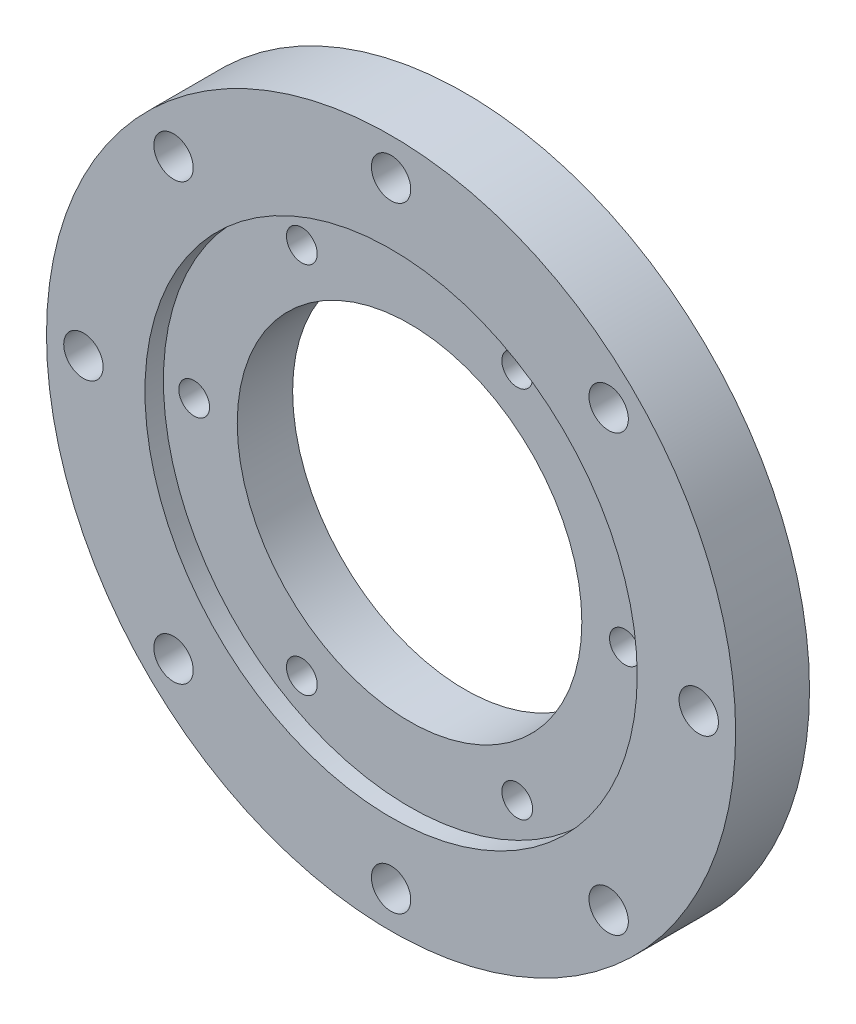
ISO-10303-21;
HEADER;
FILE_DESCRIPTION(('STEP AP214'),'2;1');
FILE_NAME('part.step','',(''),(''),'','','');
FILE_SCHEMA(('AUTOMOTIVE_DESIGN { 1 0 10303 214 1 1 1 1 }'));
ENDSEC;
DATA;
#1=APPLICATION_CONTEXT('core data for automotive mechanical design processes');
#2=APPLICATION_PROTOCOL_DEFINITION('international standard','automotive_design',2000,#1);
#3=PRODUCT_CONTEXT('',#1,'mechanical');
#4=PRODUCT('Part','Part','',(#3));
#5=PRODUCT_RELATED_PRODUCT_CATEGORY('part','',(#4));
#6=PRODUCT_DEFINITION_FORMATION('','',#4);
#7=PRODUCT_DEFINITION_CONTEXT('part definition',#1,'design');
#8=PRODUCT_DEFINITION('design','',#6,#7);
#9=PRODUCT_DEFINITION_SHAPE('','',#8);
#10=(LENGTH_UNIT() NAMED_UNIT(*) SI_UNIT(.MILLI.,.METRE.));
#11=(NAMED_UNIT(*) PLANE_ANGLE_UNIT() SI_UNIT($,.RADIAN.));
#12=(NAMED_UNIT(*) SI_UNIT($,.STERADIAN.) SOLID_ANGLE_UNIT());
#13=UNCERTAINTY_MEASURE_WITH_UNIT(LENGTH_MEASURE(1.E-05),#10,'distance_accuracy_value','');
#14=(GEOMETRIC_REPRESENTATION_CONTEXT(3) GLOBAL_UNCERTAINTY_ASSIGNED_CONTEXT((#13)) GLOBAL_UNIT_ASSIGNED_CONTEXT((#10,
#11,#12)) REPRESENTATION_CONTEXT('',''));
#15=CARTESIAN_POINT('',(0.,0.,0.));
#16=DIRECTION('',(0.,0.,1.));
#17=DIRECTION('',(1.,0.,0.));
#18=AXIS2_PLACEMENT_3D('',#15,#16,#17);
#19=CARTESIAN_POINT('',(0.,0.,0.));
#20=DIRECTION('',(0.,0.,1.));
#21=DIRECTION('',(1.,0.,0.));
#22=AXIS2_PLACEMENT_3D('',#19,#20,#21);
#23=PLANE('',#22);
#24=CARTESIAN_POINT('',(0.,25.,0.));
#25=DIRECTION('',(0.,0.,-1.));
#26=DIRECTION('',(-1.,0.,0.));
#27=AXIS2_PLACEMENT_3D('',#24,#25,#26);
#28=CIRCLE('',#27,1.6);
#29=CARTESIAN_POINT('',(-1.6,25.,0.));
#30=VERTEX_POINT('',#29);
#31=EDGE_CURVE('E147',#30,#30,#28,.T.);
#32=ORIENTED_EDGE('',*,*,#31,.F.);
#33=EDGE_LOOP('',(#32));
#34=FACE_BOUND('',#33,.T.);
#35=CARTESIAN_POINT('',(17.6776695296637,17.6776695296637,0.));
#36=DIRECTION('',(0.,0.,-1.));
#37=DIRECTION('',(-1.,0.,0.));
#38=AXIS2_PLACEMENT_3D('',#35,#36,#37);
#39=CIRCLE('',#38,1.6);
#40=CARTESIAN_POINT('',(16.0776695296637,17.6776695296637,0.));
#41=VERTEX_POINT('',#40);
#42=EDGE_CURVE('E141',#41,#41,#39,.T.);
#43=ORIENTED_EDGE('',*,*,#42,.F.);
#44=EDGE_LOOP('',(#43));
#45=FACE_BOUND('',#44,.T.);
#46=CARTESIAN_POINT('',(25.,0.,0.));
#47=DIRECTION('',(0.,0.,-1.));
#48=DIRECTION('',(-1.,0.,0.));
#49=AXIS2_PLACEMENT_3D('',#46,#47,#48);
#50=CIRCLE('',#49,1.6);
#51=CARTESIAN_POINT('',(23.4,0.,0.));
#52=VERTEX_POINT('',#51);
#53=EDGE_CURVE('E135',#52,#52,#50,.T.);
#54=ORIENTED_EDGE('',*,*,#53,.F.);
#55=EDGE_LOOP('',(#54));
#56=FACE_BOUND('',#55,.T.);
#57=CARTESIAN_POINT('',(17.6776695296637,-17.6776695296637,0.));
#58=DIRECTION('',(0.,0.,-1.));
#59=DIRECTION('',(-1.,0.,0.));
#60=AXIS2_PLACEMENT_3D('',#57,#58,#59);
#61=CIRCLE('',#60,1.6);
#62=CARTESIAN_POINT('',(16.0776695296637,-17.6776695296637,0.));
#63=VERTEX_POINT('',#62);
#64=EDGE_CURVE('E129',#63,#63,#61,.T.);
#65=ORIENTED_EDGE('',*,*,#64,.F.);
#66=EDGE_LOOP('',(#65));
#67=FACE_BOUND('',#66,.T.);
#68=CARTESIAN_POINT('',(0.,-25.,0.));
#69=DIRECTION('',(0.,0.,-1.));
#70=DIRECTION('',(-1.,0.,0.));
#71=AXIS2_PLACEMENT_3D('',#68,#69,#70);
#72=CIRCLE('',#71,1.6);
#73=CARTESIAN_POINT('',(-1.6,-25.,0.));
#74=VERTEX_POINT('',#73);
#75=EDGE_CURVE('E123',#74,#74,#72,.T.);
#76=ORIENTED_EDGE('',*,*,#75,.F.);
#77=EDGE_LOOP('',(#76));
#78=FACE_BOUND('',#77,.T.);
#79=CARTESIAN_POINT('',(-17.6776695296637,-17.6776695296637,0.));
#80=DIRECTION('',(0.,0.,-1.));
#81=DIRECTION('',(-1.,0.,0.));
#82=AXIS2_PLACEMENT_3D('',#79,#80,#81);
#83=CIRCLE('',#82,1.6);
#84=CARTESIAN_POINT('',(-19.2776695296637,-17.6776695296637,0.));
#85=VERTEX_POINT('',#84);
#86=EDGE_CURVE('E117',#85,#85,#83,.T.);
#87=ORIENTED_EDGE('',*,*,#86,.F.);
#88=EDGE_LOOP('',(#87));
#89=FACE_BOUND('',#88,.T.);
#90=CARTESIAN_POINT('',(-25.,0.,0.));
#91=DIRECTION('',(0.,0.,-1.));
#92=DIRECTION('',(-1.,0.,0.));
#93=AXIS2_PLACEMENT_3D('',#90,#91,#92);
#94=CIRCLE('',#93,1.6);
#95=CARTESIAN_POINT('',(-26.6,0.,0.));
#96=VERTEX_POINT('',#95);
#97=EDGE_CURVE('E111',#96,#96,#94,.T.);
#98=ORIENTED_EDGE('',*,*,#97,.F.);
#99=EDGE_LOOP('',(#98));
#100=FACE_BOUND('',#99,.T.);
#101=CARTESIAN_POINT('',(17.5,0.,0.));
#102=DIRECTION('',(0.,0.,-1.));
#103=DIRECTION('',(-1.,0.,0.));
#104=AXIS2_PLACEMENT_3D('',#101,#102,#103);
#105=CIRCLE('',#104,1.25);
#106=CARTESIAN_POINT('',(16.25,0.,0.));
#107=VERTEX_POINT('',#106);
#108=EDGE_CURVE('E99',#107,#107,#105,.T.);
#109=ORIENTED_EDGE('',*,*,#108,.F.);
#110=EDGE_LOOP('',(#109));
#111=FACE_BOUND('',#110,.T.);
#112=CARTESIAN_POINT('',(8.75,-15.1554445662277,0.));
#113=DIRECTION('',(0.,0.,-1.));
#114=DIRECTION('',(-1.,0.,0.));
#115=AXIS2_PLACEMENT_3D('',#112,#113,#114);
#116=CIRCLE('',#115,1.25);
#117=CARTESIAN_POINT('',(7.5,-15.1554445662277,0.));
#118=VERTEX_POINT('',#117);
#119=EDGE_CURVE('E93',#118,#118,#116,.T.);
#120=ORIENTED_EDGE('',*,*,#119,.F.);
#121=EDGE_LOOP('',(#120));
#122=FACE_BOUND('',#121,.T.);
#123=CARTESIAN_POINT('',(-8.75,-15.1554445662277,0.));
#124=DIRECTION('',(0.,0.,-1.));
#125=DIRECTION('',(-1.,0.,0.));
#126=AXIS2_PLACEMENT_3D('',#123,#124,#125);
#127=CIRCLE('',#126,1.25);
#128=CARTESIAN_POINT('',(-10.,-15.1554445662277,0.));
#129=VERTEX_POINT('',#128);
#130=EDGE_CURVE('E87',#129,#129,#127,.T.);
#131=ORIENTED_EDGE('',*,*,#130,.F.);
#132=EDGE_LOOP('',(#131));
#133=FACE_BOUND('',#132,.T.);
#134=CARTESIAN_POINT('',(-17.5,0.,0.));
#135=DIRECTION('',(0.,0.,-1.));
#136=DIRECTION('',(-1.,0.,0.));
#137=AXIS2_PLACEMENT_3D('',#134,#135,#136);
#138=CIRCLE('',#137,1.25);
#139=CARTESIAN_POINT('',(-18.75,0.,0.));
#140=VERTEX_POINT('',#139);
#141=EDGE_CURVE('E81',#140,#140,#138,.T.);
#142=ORIENTED_EDGE('',*,*,#141,.F.);
#143=EDGE_LOOP('',(#142));
#144=FACE_BOUND('',#143,.T.);
#145=CARTESIAN_POINT('',(-8.75000000000001,15.1554445662277,0.));
#146=DIRECTION('',(0.,0.,-1.));
#147=DIRECTION('',(-1.,0.,0.));
#148=AXIS2_PLACEMENT_3D('',#145,#146,#147);
#149=CIRCLE('',#148,1.25);
#150=CARTESIAN_POINT('',(-10.,15.1554445662277,0.));
#151=VERTEX_POINT('',#150);
#152=EDGE_CURVE('E75',#151,#151,#149,.T.);
#153=ORIENTED_EDGE('',*,*,#152,.F.);
#154=EDGE_LOOP('',(#153));
#155=FACE_BOUND('',#154,.T.);
#156=CARTESIAN_POINT('',(8.75,15.1554445662277,0.));
#157=DIRECTION('',(0.,0.,-1.));
#158=DIRECTION('',(-1.,0.,0.));
#159=AXIS2_PLACEMENT_3D('',#156,#157,#158);
#160=CIRCLE('',#159,1.25);
#161=CARTESIAN_POINT('',(7.5,15.1554445662277,0.));
#162=VERTEX_POINT('',#161);
#163=EDGE_CURVE('E69',#162,#162,#160,.T.);
#164=ORIENTED_EDGE('',*,*,#163,.F.);
#165=EDGE_LOOP('',(#164));
#166=FACE_BOUND('',#165,.T.);
#167=CARTESIAN_POINT('',(0.,0.,0.));
#168=DIRECTION('',(0.,0.,1.));
#169=DIRECTION('',(1.,0.,0.));
#170=AXIS2_PLACEMENT_3D('',#167,#168,#169);
#171=CIRCLE('',#170,28.);
#172=CARTESIAN_POINT('',(28.,0.,0.));
#173=VERTEX_POINT('',#172);
#174=EDGE_CURVE('E46',#173,#173,#171,.T.);
#175=ORIENTED_EDGE('',*,*,#174,.F.);
#176=EDGE_LOOP('',(#175));
#177=FACE_BOUND('',#176,.T.);
#178=CARTESIAN_POINT('',(0.,0.,0.));
#179=DIRECTION('',(0.,0.,1.));
#180=DIRECTION('',(1.,0.,0.));
#181=AXIS2_PLACEMENT_3D('',#178,#179,#180);
#182=CIRCLE('',#181,14.);
#183=CARTESIAN_POINT('',(14.,0.,0.));
#184=VERTEX_POINT('',#183);
#185=EDGE_CURVE('E53',#184,#184,#182,.T.);
#186=ORIENTED_EDGE('',*,*,#185,.T.);
#187=EDGE_LOOP('',(#186));
#188=FACE_BOUND('',#187,.T.);
#189=CARTESIAN_POINT('',(-17.6776695296637,17.6776695296637,0.));
#190=DIRECTION('',(0.,0.,-1.));
#191=DIRECTION('',(-1.,0.,0.));
#192=AXIS2_PLACEMENT_3D('',#189,#190,#191);
#193=CIRCLE('',#192,1.6);
#194=CARTESIAN_POINT('',(-19.2776695296637,17.6776695296637,0.));
#195=VERTEX_POINT('',#194);
#196=EDGE_CURVE('E105',#195,#195,#193,.T.);
#197=ORIENTED_EDGE('',*,*,#196,.F.);
#198=EDGE_LOOP('',(#197));
#199=FACE_BOUND('',#198,.T.);
#200=ADVANCED_FACE('F42',(#34,#45,#56,#67,#78,#89,#100,#111,#122,#133,#144,#155,#166,#177,#188,
#199),#23,.F.);
#201=CARTESIAN_POINT('',(0.,0.,6.));
#202=DIRECTION('',(0.,0.,-1.));
#203=DIRECTION('',(-1.,0.,0.));
#204=AXIS2_PLACEMENT_3D('',#201,#202,#203);
#205=CYLINDRICAL_SURFACE('',#204,14.);
#206=ORIENTED_EDGE('',*,*,#185,.F.);
#207=EDGE_LOOP('',(#206));
#208=FACE_BOUND('',#207,.T.);
#209=CARTESIAN_POINT('',(0.,0.,4.5));
#210=DIRECTION('',(0.,0.,1.));
#211=DIRECTION('',(1.,0.,0.));
#212=AXIS2_PLACEMENT_3D('',#209,#210,#211);
#213=CIRCLE('',#212,14.);
#214=CARTESIAN_POINT('',(14.,0.,4.5));
#215=VERTEX_POINT('',#214);
#216=EDGE_CURVE('E61',#215,#215,#213,.T.);
#217=ORIENTED_EDGE('',*,*,#216,.T.);
#218=EDGE_LOOP('',(#217));
#219=FACE_BOUND('',#218,.T.);
#220=ADVANCED_FACE('F155',(#208,#219),#205,.F.);
#221=CARTESIAN_POINT('',(0.,0.,6.));
#222=DIRECTION('',(0.,0.,1.));
#223=DIRECTION('',(1.,0.,0.));
#224=AXIS2_PLACEMENT_3D('',#221,#222,#223);
#225=PLANE('',#224);
#226=CARTESIAN_POINT('',(0.,25.,6.));
#227=DIRECTION('',(0.,0.,-1.));
#228=DIRECTION('',(-1.,0.,0.));
#229=AXIS2_PLACEMENT_3D('',#226,#227,#228);
#230=CIRCLE('',#229,1.6);
#231=CARTESIAN_POINT('',(-1.6,25.,6.));
#232=VERTEX_POINT('',#231);
#233=EDGE_CURVE('E144',#232,#232,#230,.T.);
#234=ORIENTED_EDGE('',*,*,#233,.T.);
#235=EDGE_LOOP('',(#234));
#236=FACE_BOUND('',#235,.T.);
#237=CARTESIAN_POINT('',(17.6776695296637,17.6776695296637,6.));
#238=DIRECTION('',(0.,0.,-1.));
#239=DIRECTION('',(-1.,0.,0.));
#240=AXIS2_PLACEMENT_3D('',#237,#238,#239);
#241=CIRCLE('',#240,1.6);
#242=CARTESIAN_POINT('',(16.0776695296637,17.6776695296637,6.));
#243=VERTEX_POINT('',#242);
#244=EDGE_CURVE('E138',#243,#243,#241,.T.);
#245=ORIENTED_EDGE('',*,*,#244,.T.);
#246=EDGE_LOOP('',(#245));
#247=FACE_BOUND('',#246,.T.);
#248=CARTESIAN_POINT('',(25.,0.,6.));
#249=DIRECTION('',(0.,0.,-1.));
#250=DIRECTION('',(-1.,0.,0.));
#251=AXIS2_PLACEMENT_3D('',#248,#249,#250);
#252=CIRCLE('',#251,1.6);
#253=CARTESIAN_POINT('',(23.4,0.,6.));
#254=VERTEX_POINT('',#253);
#255=EDGE_CURVE('E132',#254,#254,#252,.T.);
#256=ORIENTED_EDGE('',*,*,#255,.T.);
#257=EDGE_LOOP('',(#256));
#258=FACE_BOUND('',#257,.T.);
#259=CARTESIAN_POINT('',(17.6776695296637,-17.6776695296637,6.));
#260=DIRECTION('',(0.,0.,-1.));
#261=DIRECTION('',(-1.,0.,0.));
#262=AXIS2_PLACEMENT_3D('',#259,#260,#261);
#263=CIRCLE('',#262,1.6);
#264=CARTESIAN_POINT('',(16.0776695296637,-17.6776695296637,6.));
#265=VERTEX_POINT('',#264);
#266=EDGE_CURVE('E126',#265,#265,#263,.T.);
#267=ORIENTED_EDGE('',*,*,#266,.T.);
#268=EDGE_LOOP('',(#267));
#269=FACE_BOUND('',#268,.T.);
#270=CARTESIAN_POINT('',(0.,-25.,6.));
#271=DIRECTION('',(0.,0.,-1.));
#272=DIRECTION('',(-1.,0.,0.));
#273=AXIS2_PLACEMENT_3D('',#270,#271,#272);
#274=CIRCLE('',#273,1.6);
#275=CARTESIAN_POINT('',(-1.59999999999999,-25.,6.));
#276=VERTEX_POINT('',#275);
#277=EDGE_CURVE('E120',#276,#276,#274,.T.);
#278=ORIENTED_EDGE('',*,*,#277,.T.);
#279=EDGE_LOOP('',(#278));
#280=FACE_BOUND('',#279,.T.);
#281=CARTESIAN_POINT('',(-17.6776695296637,-17.6776695296637,6.));
#282=DIRECTION('',(0.,0.,-1.));
#283=DIRECTION('',(-1.,0.,0.));
#284=AXIS2_PLACEMENT_3D('',#281,#282,#283);
#285=CIRCLE('',#284,1.6);
#286=CARTESIAN_POINT('',(-19.2776695296637,-17.6776695296637,6.));
#287=VERTEX_POINT('',#286);
#288=EDGE_CURVE('E114',#287,#287,#285,.T.);
#289=ORIENTED_EDGE('',*,*,#288,.T.);
#290=EDGE_LOOP('',(#289));
#291=FACE_BOUND('',#290,.T.);
#292=CARTESIAN_POINT('',(-25.,0.,6.));
#293=DIRECTION('',(0.,0.,-1.));
#294=DIRECTION('',(-1.,0.,0.));
#295=AXIS2_PLACEMENT_3D('',#292,#293,#294);
#296=CIRCLE('',#295,1.6);
#297=CARTESIAN_POINT('',(-26.6,0.,6.));
#298=VERTEX_POINT('',#297);
#299=EDGE_CURVE('E108',#298,#298,#296,.T.);
#300=ORIENTED_EDGE('',*,*,#299,.T.);
#301=EDGE_LOOP('',(#300));
#302=FACE_BOUND('',#301,.T.);
#303=CARTESIAN_POINT('',(-17.6776695296637,17.6776695296637,6.));
#304=DIRECTION('',(0.,0.,-1.));
#305=DIRECTION('',(-1.,0.,0.));
#306=AXIS2_PLACEMENT_3D('',#303,#304,#305);
#307=CIRCLE('',#306,1.6);
#308=CARTESIAN_POINT('',(-19.2776695296637,17.6776695296637,6.));
#309=VERTEX_POINT('',#308);
#310=EDGE_CURVE('E102',#309,#309,#307,.T.);
#311=ORIENTED_EDGE('',*,*,#310,.T.);
#312=EDGE_LOOP('',(#311));
#313=FACE_BOUND('',#312,.T.);
#314=CARTESIAN_POINT('',(0.,0.,6.));
#315=DIRECTION('',(0.,0.,1.));
#316=DIRECTION('',(1.,0.,0.));
#317=AXIS2_PLACEMENT_3D('',#314,#315,#316);
#318=CIRCLE('',#317,20.);
#319=CARTESIAN_POINT('',(20.,0.,6.));
#320=VERTEX_POINT('',#319);
#321=EDGE_CURVE('E58',#320,#320,#318,.T.);
#322=ORIENTED_EDGE('',*,*,#321,.F.);
#323=EDGE_LOOP('',(#322));
#324=FACE_BOUND('',#323,.T.);
#325=CARTESIAN_POINT('',(0.,0.,6.));
#326=DIRECTION('',(0.,0.,1.));
#327=DIRECTION('',(1.,0.,0.));
#328=AXIS2_PLACEMENT_3D('',#325,#326,#327);
#329=CIRCLE('',#328,28.);
#330=CARTESIAN_POINT('',(28.,0.,6.));
#331=VERTEX_POINT('',#330);
#332=EDGE_CURVE('E11',#331,#331,#329,.T.);
#333=ORIENTED_EDGE('',*,*,#332,.T.);
#334=EDGE_LOOP('',(#333));
#335=FACE_BOUND('',#334,.T.);
#336=ADVANCED_FACE('F234',(#236,#247,#258,#269,#280,#291,#302,#313,#324,#335),#225,.T.);
#337=CARTESIAN_POINT('',(0.,0.,6.));
#338=DIRECTION('',(0.,0.,-1.));
#339=DIRECTION('',(-1.,0.,0.));
#340=AXIS2_PLACEMENT_3D('',#337,#338,#339);
#341=CYLINDRICAL_SURFACE('',#340,28.);
#342=ORIENTED_EDGE('',*,*,#332,.F.);
#343=EDGE_LOOP('',(#342));
#344=FACE_BOUND('',#343,.T.);
#345=ORIENTED_EDGE('',*,*,#174,.T.);
#346=EDGE_LOOP('',(#345));
#347=FACE_BOUND('',#346,.T.);
#348=ADVANCED_FACE('F44',(#344,#347),#341,.T.);
#349=CARTESIAN_POINT('',(0.,0.,4.5));
#350=DIRECTION('',(0.,0.,1.));
#351=DIRECTION('',(1.,0.,0.));
#352=AXIS2_PLACEMENT_3D('',#349,#350,#351);
#353=CYLINDRICAL_SURFACE('',#352,20.);
#354=CARTESIAN_POINT('',(0.,0.,4.5));
#355=DIRECTION('',(0.,0.,1.));
#356=DIRECTION('',(1.,0.,0.));
#357=AXIS2_PLACEMENT_3D('',#354,#355,#356);
#358=CIRCLE('',#357,20.);
#359=CARTESIAN_POINT('',(20.,0.,4.5));
#360=VERTEX_POINT('',#359);
#361=EDGE_CURVE('E57',#360,#360,#358,.T.);
#362=ORIENTED_EDGE('',*,*,#361,.F.);
#363=EDGE_LOOP('',(#362));
#364=FACE_BOUND('',#363,.T.);
#365=ORIENTED_EDGE('',*,*,#321,.T.);
#366=EDGE_LOOP('',(#365));
#367=FACE_BOUND('',#366,.T.);
#368=ADVANCED_FACE('F227',(#364,#367),#353,.F.);
#369=CARTESIAN_POINT('',(0.,0.,4.5));
#370=DIRECTION('',(0.,0.,1.));
#371=DIRECTION('',(1.,0.,0.));
#372=AXIS2_PLACEMENT_3D('',#369,#370,#371);
#373=PLANE('',#372);
#374=CARTESIAN_POINT('',(17.5,0.,4.5));
#375=DIRECTION('',(0.,0.,1.));
#376=DIRECTION('',(1.,0.,0.));
#377=AXIS2_PLACEMENT_3D('',#374,#375,#376);
#378=CIRCLE('',#377,1.25);
#379=CARTESIAN_POINT('',(18.75,0.,4.5));
#380=VERTEX_POINT('',#379);
#381=EDGE_CURVE('E96',#380,#380,#378,.T.);
#382=ORIENTED_EDGE('',*,*,#381,.F.);
#383=EDGE_LOOP('',(#382));
#384=FACE_BOUND('',#383,.T.);
#385=CARTESIAN_POINT('',(8.75,-15.1554445662277,4.5));
#386=DIRECTION('',(0.,0.,1.));
#387=DIRECTION('',(1.,0.,0.));
#388=AXIS2_PLACEMENT_3D('',#385,#386,#387);
#389=CIRCLE('',#388,1.25);
#390=CARTESIAN_POINT('',(10.,-15.1554445662277,4.5));
#391=VERTEX_POINT('',#390);
#392=EDGE_CURVE('E90',#391,#391,#389,.T.);
#393=ORIENTED_EDGE('',*,*,#392,.F.);
#394=EDGE_LOOP('',(#393));
#395=FACE_BOUND('',#394,.T.);
#396=CARTESIAN_POINT('',(-8.75,-15.1554445662277,4.5));
#397=DIRECTION('',(0.,0.,1.));
#398=DIRECTION('',(1.,0.,0.));
#399=AXIS2_PLACEMENT_3D('',#396,#397,#398);
#400=CIRCLE('',#399,1.25);
#401=CARTESIAN_POINT('',(-7.5,-15.1554445662277,4.5));
#402=VERTEX_POINT('',#401);
#403=EDGE_CURVE('E84',#402,#402,#400,.T.);
#404=ORIENTED_EDGE('',*,*,#403,.F.);
#405=EDGE_LOOP('',(#404));
#406=FACE_BOUND('',#405,.T.);
#407=CARTESIAN_POINT('',(-17.5,0.,4.5));
#408=DIRECTION('',(0.,0.,1.));
#409=DIRECTION('',(1.,0.,0.));
#410=AXIS2_PLACEMENT_3D('',#407,#408,#409);
#411=CIRCLE('',#410,1.25);
#412=CARTESIAN_POINT('',(-16.25,0.,4.5));
#413=VERTEX_POINT('',#412);
#414=EDGE_CURVE('E78',#413,#413,#411,.T.);
#415=ORIENTED_EDGE('',*,*,#414,.F.);
#416=EDGE_LOOP('',(#415));
#417=FACE_BOUND('',#416,.T.);
#418=CARTESIAN_POINT('',(-8.75000000000001,15.1554445662277,4.5));
#419=DIRECTION('',(0.,0.,1.));
#420=DIRECTION('',(1.,0.,0.));
#421=AXIS2_PLACEMENT_3D('',#418,#419,#420);
#422=CIRCLE('',#421,1.25);
#423=CARTESIAN_POINT('',(-7.50000000000001,15.1554445662277,4.5));
#424=VERTEX_POINT('',#423);
#425=EDGE_CURVE('E72',#424,#424,#422,.T.);
#426=ORIENTED_EDGE('',*,*,#425,.F.);
#427=EDGE_LOOP('',(#426));
#428=FACE_BOUND('',#427,.T.);
#429=CARTESIAN_POINT('',(8.75,15.1554445662277,4.5));
#430=DIRECTION('',(0.,0.,1.));
#431=DIRECTION('',(1.,0.,0.));
#432=AXIS2_PLACEMENT_3D('',#429,#430,#431);
#433=CIRCLE('',#432,1.25);
#434=CARTESIAN_POINT('',(10.,15.1554445662277,4.5));
#435=VERTEX_POINT('',#434);
#436=EDGE_CURVE('E66',#435,#435,#433,.T.);
#437=ORIENTED_EDGE('',*,*,#436,.F.);
#438=EDGE_LOOP('',(#437));
#439=FACE_BOUND('',#438,.T.);
#440=ORIENTED_EDGE('',*,*,#216,.F.);
#441=EDGE_LOOP('',(#440));
#442=FACE_BOUND('',#441,.T.);
#443=ORIENTED_EDGE('',*,*,#361,.T.);
#444=EDGE_LOOP('',(#443));
#445=FACE_BOUND('',#444,.T.);
#446=ADVANCED_FACE('F223',(#384,#395,#406,#417,#428,#439,#442,#445),#373,.T.);
#447=CARTESIAN_POINT('',(8.75,15.1554445662277,0.));
#448=DIRECTION('',(0.,0.,-1.));
#449=DIRECTION('',(-1.,0.,0.));
#450=AXIS2_PLACEMENT_3D('',#447,#448,#449);
#451=CYLINDRICAL_SURFACE('',#450,1.25);
#452=ORIENTED_EDGE('',*,*,#436,.T.);
#453=EDGE_LOOP('',(#452));
#454=FACE_BOUND('',#453,.T.);
#455=ORIENTED_EDGE('',*,*,#163,.T.);
#456=EDGE_LOOP('',(#455));
#457=FACE_BOUND('',#456,.T.);
#458=ADVANCED_FACE('F219',(#454,#457),#451,.F.);
#459=CARTESIAN_POINT('',(-8.75000000000001,15.1554445662277,0.));
#460=DIRECTION('',(0.,0.,-1.));
#461=DIRECTION('',(-1.,0.,0.));
#462=AXIS2_PLACEMENT_3D('',#459,#460,#461);
#463=CYLINDRICAL_SURFACE('',#462,1.25);
#464=ORIENTED_EDGE('',*,*,#425,.T.);
#465=EDGE_LOOP('',(#464));
#466=FACE_BOUND('',#465,.T.);
#467=ORIENTED_EDGE('',*,*,#152,.T.);
#468=EDGE_LOOP('',(#467));
#469=FACE_BOUND('',#468,.T.);
#470=ADVANCED_FACE('F215',(#466,#469),#463,.F.);
#471=CARTESIAN_POINT('',(-17.5,0.,0.));
#472=DIRECTION('',(0.,0.,-1.));
#473=DIRECTION('',(-1.,0.,0.));
#474=AXIS2_PLACEMENT_3D('',#471,#472,#473);
#475=CYLINDRICAL_SURFACE('',#474,1.25);
#476=ORIENTED_EDGE('',*,*,#414,.T.);
#477=EDGE_LOOP('',(#476));
#478=FACE_BOUND('',#477,.T.);
#479=ORIENTED_EDGE('',*,*,#141,.T.);
#480=EDGE_LOOP('',(#479));
#481=FACE_BOUND('',#480,.T.);
#482=ADVANCED_FACE('F211',(#478,#481),#475,.F.);
#483=CARTESIAN_POINT('',(-8.75,-15.1554445662277,0.));
#484=DIRECTION('',(0.,0.,-1.));
#485=DIRECTION('',(-1.,0.,0.));
#486=AXIS2_PLACEMENT_3D('',#483,#484,#485);
#487=CYLINDRICAL_SURFACE('',#486,1.25);
#488=ORIENTED_EDGE('',*,*,#403,.T.);
#489=EDGE_LOOP('',(#488));
#490=FACE_BOUND('',#489,.T.);
#491=ORIENTED_EDGE('',*,*,#130,.T.);
#492=EDGE_LOOP('',(#491));
#493=FACE_BOUND('',#492,.T.);
#494=ADVANCED_FACE('F207',(#490,#493),#487,.F.);
#495=CARTESIAN_POINT('',(8.75,-15.1554445662277,0.));
#496=DIRECTION('',(0.,0.,-1.));
#497=DIRECTION('',(-1.,0.,0.));
#498=AXIS2_PLACEMENT_3D('',#495,#496,#497);
#499=CYLINDRICAL_SURFACE('',#498,1.25);
#500=ORIENTED_EDGE('',*,*,#392,.T.);
#501=EDGE_LOOP('',(#500));
#502=FACE_BOUND('',#501,.T.);
#503=ORIENTED_EDGE('',*,*,#119,.T.);
#504=EDGE_LOOP('',(#503));
#505=FACE_BOUND('',#504,.T.);
#506=ADVANCED_FACE('F199',(#502,#505),#499,.F.);
#507=CARTESIAN_POINT('',(17.5,0.,0.));
#508=DIRECTION('',(0.,0.,-1.));
#509=DIRECTION('',(-1.,0.,0.));
#510=AXIS2_PLACEMENT_3D('',#507,#508,#509);
#511=CYLINDRICAL_SURFACE('',#510,1.25);
#512=ORIENTED_EDGE('',*,*,#381,.T.);
#513=EDGE_LOOP('',(#512));
#514=FACE_BOUND('',#513,.T.);
#515=ORIENTED_EDGE('',*,*,#108,.T.);
#516=EDGE_LOOP('',(#515));
#517=FACE_BOUND('',#516,.T.);
#518=ADVANCED_FACE('F189',(#514,#517),#511,.F.);
#519=CARTESIAN_POINT('',(-17.6776695296637,17.6776695296637,0.));
#520=DIRECTION('',(0.,0.,-1.));
#521=DIRECTION('',(-1.,0.,0.));
#522=AXIS2_PLACEMENT_3D('',#519,#520,#521);
#523=CYLINDRICAL_SURFACE('',#522,1.6);
#524=ORIENTED_EDGE('',*,*,#310,.F.);
#525=EDGE_LOOP('',(#524));
#526=FACE_BOUND('',#525,.T.);
#527=ORIENTED_EDGE('',*,*,#196,.T.);
#528=EDGE_LOOP('',(#527));
#529=FACE_BOUND('',#528,.T.);
#530=ADVANCED_FACE('F186',(#526,#529),#523,.F.);
#531=CARTESIAN_POINT('',(-25.,0.,0.));
#532=DIRECTION('',(0.,0.,-1.));
#533=DIRECTION('',(-1.,0.,0.));
#534=AXIS2_PLACEMENT_3D('',#531,#532,#533);
#535=CYLINDRICAL_SURFACE('',#534,1.6);
#536=ORIENTED_EDGE('',*,*,#299,.F.);
#537=EDGE_LOOP('',(#536));
#538=FACE_BOUND('',#537,.T.);
#539=ORIENTED_EDGE('',*,*,#97,.T.);
#540=EDGE_LOOP('',(#539));
#541=FACE_BOUND('',#540,.T.);
#542=ADVANCED_FACE('F188',(#538,#541),#535,.F.);
#543=CARTESIAN_POINT('',(-17.6776695296637,-17.6776695296637,0.));
#544=DIRECTION('',(0.,0.,-1.));
#545=DIRECTION('',(-1.,0.,0.));
#546=AXIS2_PLACEMENT_3D('',#543,#544,#545);
#547=CYLINDRICAL_SURFACE('',#546,1.6);
#548=ORIENTED_EDGE('',*,*,#288,.F.);
#549=EDGE_LOOP('',(#548));
#550=FACE_BOUND('',#549,.T.);
#551=ORIENTED_EDGE('',*,*,#86,.T.);
#552=EDGE_LOOP('',(#551));
#553=FACE_BOUND('',#552,.T.);
#554=ADVANCED_FACE('F196',(#550,#553),#547,.F.);
#555=CARTESIAN_POINT('',(0.,-25.,0.));
#556=DIRECTION('',(0.,0.,-1.));
#557=DIRECTION('',(-1.,0.,0.));
#558=AXIS2_PLACEMENT_3D('',#555,#556,#557);
#559=CYLINDRICAL_SURFACE('',#558,1.6);
#560=ORIENTED_EDGE('',*,*,#277,.F.);
#561=EDGE_LOOP('',(#560));
#562=FACE_BOUND('',#561,.T.);
#563=ORIENTED_EDGE('',*,*,#75,.T.);
#564=EDGE_LOOP('',(#563));
#565=FACE_BOUND('',#564,.T.);
#566=ADVANCED_FACE('F263',(#562,#565),#559,.F.);
#567=CARTESIAN_POINT('',(17.6776695296637,-17.6776695296637,0.));
#568=DIRECTION('',(0.,0.,-1.));
#569=DIRECTION('',(-1.,0.,0.));
#570=AXIS2_PLACEMENT_3D('',#567,#568,#569);
#571=CYLINDRICAL_SURFACE('',#570,1.6);
#572=ORIENTED_EDGE('',*,*,#266,.F.);
#573=EDGE_LOOP('',(#572));
#574=FACE_BOUND('',#573,.T.);
#575=ORIENTED_EDGE('',*,*,#64,.T.);
#576=EDGE_LOOP('',(#575));
#577=FACE_BOUND('',#576,.T.);
#578=ADVANCED_FACE('F267',(#574,#577),#571,.F.);
#579=CARTESIAN_POINT('',(25.,0.,0.));
#580=DIRECTION('',(0.,0.,-1.));
#581=DIRECTION('',(-1.,0.,0.));
#582=AXIS2_PLACEMENT_3D('',#579,#580,#581);
#583=CYLINDRICAL_SURFACE('',#582,1.6);
#584=ORIENTED_EDGE('',*,*,#255,.F.);
#585=EDGE_LOOP('',(#584));
#586=FACE_BOUND('',#585,.T.);
#587=ORIENTED_EDGE('',*,*,#53,.T.);
#588=EDGE_LOOP('',(#587));
#589=FACE_BOUND('',#588,.T.);
#590=ADVANCED_FACE('F273',(#586,#589),#583,.F.);
#591=CARTESIAN_POINT('',(17.6776695296637,17.6776695296637,0.));
#592=DIRECTION('',(0.,0.,-1.));
#593=DIRECTION('',(-1.,0.,0.));
#594=AXIS2_PLACEMENT_3D('',#591,#592,#593);
#595=CYLINDRICAL_SURFACE('',#594,1.6);
#596=ORIENTED_EDGE('',*,*,#244,.F.);
#597=EDGE_LOOP('',(#596));
#598=FACE_BOUND('',#597,.T.);
#599=ORIENTED_EDGE('',*,*,#42,.T.);
#600=EDGE_LOOP('',(#599));
#601=FACE_BOUND('',#600,.T.);
#602=ADVANCED_FACE('F277',(#598,#601),#595,.F.);
#603=CARTESIAN_POINT('',(0.,25.,0.));
#604=DIRECTION('',(0.,0.,-1.));
#605=DIRECTION('',(-1.,0.,0.));
#606=AXIS2_PLACEMENT_3D('',#603,#604,#605);
#607=CYLINDRICAL_SURFACE('',#606,1.6);
#608=ORIENTED_EDGE('',*,*,#233,.F.);
#609=EDGE_LOOP('',(#608));
#610=FACE_BOUND('',#609,.T.);
#611=ORIENTED_EDGE('',*,*,#31,.T.);
#612=EDGE_LOOP('',(#611));
#613=FACE_BOUND('',#612,.T.);
#614=ADVANCED_FACE('F151',(#610,#613),#607,.F.);
#615=CLOSED_SHELL('',(#200,#220,#336,#348,#368,#446,#458,#470,#482,#494,#506,#518,#530,#542,
#554,#566,#578,#590,#602,#614));
#616=MANIFOLD_SOLID_BREP('B2',#615);
#617=ADVANCED_BREP_SHAPE_REPRESENTATION('',(#18,#616),#14);
#618=SHAPE_DEFINITION_REPRESENTATION(#9,#617);
ENDSEC;
END-ISO-10303-21;
